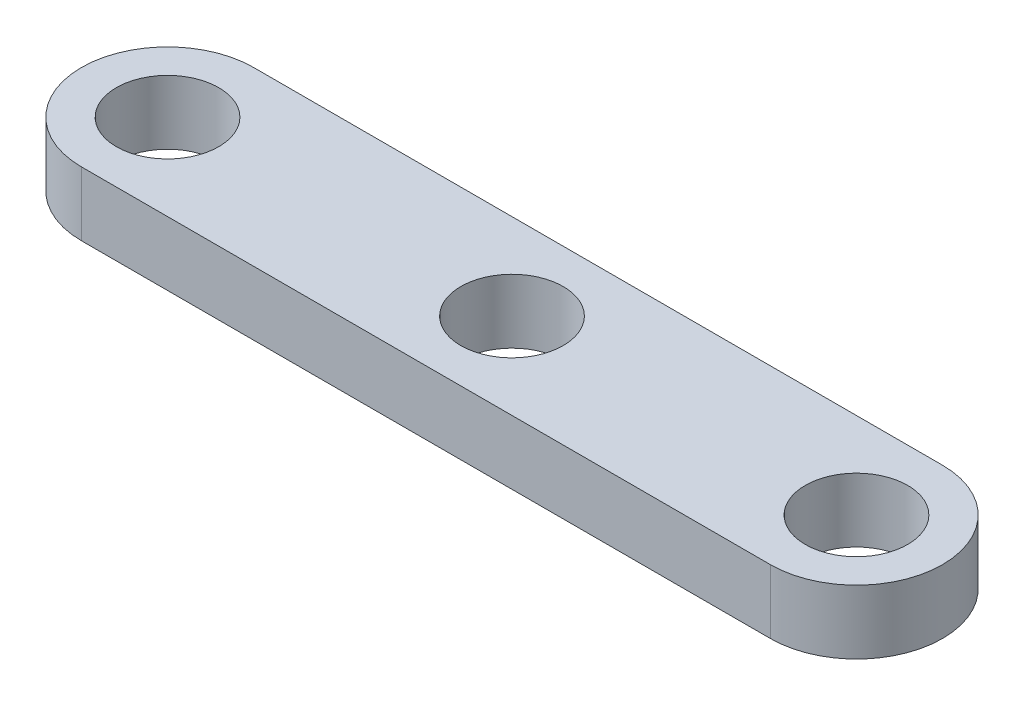
ISO-10303-21;
HEADER;
FILE_DESCRIPTION(('STEP AP214'),'2;1');
FILE_NAME('part.step','',(''),(''),'','','');
FILE_SCHEMA(('AUTOMOTIVE_DESIGN { 1 0 10303 214 1 1 1 1 }'));
ENDSEC;
DATA;
#1=APPLICATION_CONTEXT('core data for automotive mechanical design processes');
#2=APPLICATION_PROTOCOL_DEFINITION('international standard','automotive_design',2000,#1);
#3=PRODUCT_CONTEXT('',#1,'mechanical');
#4=PRODUCT('Part','Part','',(#3));
#5=PRODUCT_RELATED_PRODUCT_CATEGORY('part','',(#4));
#6=PRODUCT_DEFINITION_FORMATION('','',#4);
#7=PRODUCT_DEFINITION_CONTEXT('part definition',#1,'design');
#8=PRODUCT_DEFINITION('design','',#6,#7);
#9=PRODUCT_DEFINITION_SHAPE('','',#8);
#10=(LENGTH_UNIT() NAMED_UNIT(*) SI_UNIT(.MILLI.,.METRE.));
#11=(NAMED_UNIT(*) PLANE_ANGLE_UNIT() SI_UNIT($,.RADIAN.));
#12=(NAMED_UNIT(*) SI_UNIT($,.STERADIAN.) SOLID_ANGLE_UNIT());
#13=UNCERTAINTY_MEASURE_WITH_UNIT(LENGTH_MEASURE(1.E-05),#10,'distance_accuracy_value','');
#14=(GEOMETRIC_REPRESENTATION_CONTEXT(3) GLOBAL_UNCERTAINTY_ASSIGNED_CONTEXT((#13)) GLOBAL_UNIT_ASSIGNED_CONTEXT((#10,
#11,#12)) REPRESENTATION_CONTEXT('',''));
#15=CARTESIAN_POINT('',(0.,0.,0.));
#16=DIRECTION('',(0.,0.,1.));
#17=DIRECTION('',(1.,0.,0.));
#18=AXIS2_PLACEMENT_3D('',#15,#16,#17);
#19=CARTESIAN_POINT('',(0.,3.,4.035));
#20=DIRECTION('',(0.,0.,-1.));
#21=DIRECTION('',(-1.,0.,0.));
#22=AXIS2_PLACEMENT_3D('',#19,#20,#21);
#23=PLANE('',#22);
#24=DIRECTION('',(1.,0.,0.));
#25=VECTOR('',#24,1.);
#26=CARTESIAN_POINT('',(0.,0.,4.035));
#27=LINE('',#26,#25);
#28=CARTESIAN_POINT('',(-16.145,0.,4.035));
#29=VERTEX_POINT('',#28);
#30=CARTESIAN_POINT('',(16.145,0.,4.035));
#31=VERTEX_POINT('',#30);
#32=EDGE_CURVE('E112',#29,#31,#27,.T.);
#33=ORIENTED_EDGE('',*,*,#32,.T.);
#34=DIRECTION('',(0.,-1.,0.));
#35=VECTOR('',#34,1.);
#36=CARTESIAN_POINT('',(16.145,3.,4.035));
#37=LINE('',#36,#35);
#38=CARTESIAN_POINT('',(16.145,3.,4.035));
#39=VERTEX_POINT('',#38);
#40=EDGE_CURVE('E11',#39,#31,#37,.T.);
#41=ORIENTED_EDGE('',*,*,#40,.F.);
#42=DIRECTION('',(1.,0.,0.));
#43=VECTOR('',#42,1.);
#44=CARTESIAN_POINT('',(0.,3.,4.035));
#45=LINE('',#44,#43);
#46=CARTESIAN_POINT('',(-16.145,3.,4.035));
#47=VERTEX_POINT('',#46);
#48=EDGE_CURVE('E88',#47,#39,#45,.T.);
#49=ORIENTED_EDGE('',*,*,#48,.F.);
#50=DIRECTION('',(0.,-1.,0.));
#51=VECTOR('',#50,1.);
#52=CARTESIAN_POINT('',(-16.145,3.,4.035));
#53=LINE('',#52,#51);
#54=EDGE_CURVE('E99',#47,#29,#53,.T.);
#55=ORIENTED_EDGE('',*,*,#54,.T.);
#56=EDGE_LOOP('',(#33,#41,#49,#55));
#57=FACE_BOUND('',#56,.T.);
#58=ADVANCED_FACE('F40',(#57),#23,.F.);
#59=CARTESIAN_POINT('',(16.145,3.,0.));
#60=DIRECTION('',(0.,-1.,0.));
#61=DIRECTION('',(0.,0.,-1.));
#62=AXIS2_PLACEMENT_3D('',#59,#60,#61);
#63=CYLINDRICAL_SURFACE('',#62,4.035);
#64=CARTESIAN_POINT('',(16.145,0.,0.));
#65=DIRECTION('',(0.,1.,0.));
#66=DIRECTION('',(0.,0.,1.));
#67=AXIS2_PLACEMENT_3D('',#64,#65,#66);
#68=CIRCLE('',#67,4.035);
#69=CARTESIAN_POINT('',(16.145,0.,-4.035));
#70=VERTEX_POINT('',#69);
#71=EDGE_CURVE('E93',#31,#70,#68,.T.);
#72=ORIENTED_EDGE('',*,*,#71,.T.);
#73=DIRECTION('',(0.,-1.,0.));
#74=VECTOR('',#73,1.);
#75=CARTESIAN_POINT('',(16.145,3.,-4.035));
#76=LINE('',#75,#74);
#77=CARTESIAN_POINT('',(16.145,3.,-4.035));
#78=VERTEX_POINT('',#77);
#79=EDGE_CURVE('E49',#78,#70,#76,.T.);
#80=ORIENTED_EDGE('',*,*,#79,.F.);
#81=CARTESIAN_POINT('',(16.145,3.,0.));
#82=DIRECTION('',(0.,1.,0.));
#83=DIRECTION('',(0.,0.,1.));
#84=AXIS2_PLACEMENT_3D('',#81,#82,#83);
#85=CIRCLE('',#84,4.035);
#86=EDGE_CURVE('E83',#39,#78,#85,.T.);
#87=ORIENTED_EDGE('',*,*,#86,.F.);
#88=ORIENTED_EDGE('',*,*,#40,.T.);
#89=EDGE_LOOP('',(#72,#80,#87,#88));
#90=FACE_BOUND('',#89,.T.);
#91=ADVANCED_FACE('F92',(#90),#63,.T.);
#92=CARTESIAN_POINT('',(0.,3.,-4.035));
#93=DIRECTION('',(0.,0.,-1.));
#94=DIRECTION('',(-1.,0.,0.));
#95=AXIS2_PLACEMENT_3D('',#92,#93,#94);
#96=PLANE('',#95);
#97=DIRECTION('',(1.,0.,0.));
#98=VECTOR('',#97,1.);
#99=CARTESIAN_POINT('',(0.,0.,-4.035));
#100=LINE('',#99,#98);
#101=CARTESIAN_POINT('',(-16.145,0.,-4.035));
#102=VERTEX_POINT('',#101);
#103=EDGE_CURVE('E116',#102,#70,#100,.T.);
#104=ORIENTED_EDGE('',*,*,#103,.F.);
#105=DIRECTION('',(0.,-1.,0.));
#106=VECTOR('',#105,1.);
#107=CARTESIAN_POINT('',(-16.145,3.,-4.035));
#108=LINE('',#107,#106);
#109=CARTESIAN_POINT('',(-16.145,3.,-4.035));
#110=VERTEX_POINT('',#109);
#111=EDGE_CURVE('E73',#110,#102,#108,.T.);
#112=ORIENTED_EDGE('',*,*,#111,.F.);
#113=DIRECTION('',(1.,0.,0.));
#114=VECTOR('',#113,1.);
#115=CARTESIAN_POINT('',(0.,3.,-4.035));
#116=LINE('',#115,#114);
#117=EDGE_CURVE('E86',#110,#78,#116,.T.);
#118=ORIENTED_EDGE('',*,*,#117,.T.);
#119=ORIENTED_EDGE('',*,*,#79,.T.);
#120=EDGE_LOOP('',(#104,#112,#118,#119));
#121=FACE_BOUND('',#120,.T.);
#122=ADVANCED_FACE('F97',(#121),#96,.T.);
#123=CARTESIAN_POINT('',(-16.145,3.,0.));
#124=DIRECTION('',(0.,-1.,0.));
#125=DIRECTION('',(0.,0.,-1.));
#126=AXIS2_PLACEMENT_3D('',#123,#124,#125);
#127=CYLINDRICAL_SURFACE('',#126,2.4);
#128=CARTESIAN_POINT('',(-16.145,3.,0.));
#129=DIRECTION('',(0.,1.,0.));
#130=DIRECTION('',(0.,0.,1.));
#131=AXIS2_PLACEMENT_3D('',#128,#129,#130);
#132=CIRCLE('',#131,2.4);
#133=CARTESIAN_POINT('',(-16.145,3.,2.4));
#134=VERTEX_POINT('',#133);
#135=EDGE_CURVE('E163',#134,#134,#132,.T.);
#136=ORIENTED_EDGE('',*,*,#135,.T.);
#137=EDGE_LOOP('',(#136));
#138=FACE_BOUND('',#137,.T.);
#139=CARTESIAN_POINT('',(-16.145,0.,0.));
#140=DIRECTION('',(0.,1.,0.));
#141=DIRECTION('',(0.,0.,1.));
#142=AXIS2_PLACEMENT_3D('',#139,#140,#141);
#143=CIRCLE('',#142,2.4);
#144=CARTESIAN_POINT('',(-16.145,0.,2.4));
#145=VERTEX_POINT('',#144);
#146=EDGE_CURVE('E109',#145,#145,#143,.T.);
#147=ORIENTED_EDGE('',*,*,#146,.F.);
#148=EDGE_LOOP('',(#147));
#149=FACE_BOUND('',#148,.T.);
#150=ADVANCED_FACE('F144',(#138,#149),#127,.F.);
#151=CARTESIAN_POINT('',(16.145,3.,0.));
#152=DIRECTION('',(0.,-1.,0.));
#153=DIRECTION('',(0.,0.,-1.));
#154=AXIS2_PLACEMENT_3D('',#151,#152,#153);
#155=CYLINDRICAL_SURFACE('',#154,2.4);
#156=CARTESIAN_POINT('',(16.145,3.,0.));
#157=DIRECTION('',(0.,1.,0.));
#158=DIRECTION('',(0.,0.,1.));
#159=AXIS2_PLACEMENT_3D('',#156,#157,#158);
#160=CIRCLE('',#159,2.4);
#161=CARTESIAN_POINT('',(16.145,3.,2.4));
#162=VERTEX_POINT('',#161);
#163=EDGE_CURVE('E157',#162,#162,#160,.T.);
#164=ORIENTED_EDGE('',*,*,#163,.T.);
#165=EDGE_LOOP('',(#164));
#166=FACE_BOUND('',#165,.T.);
#167=CARTESIAN_POINT('',(16.145,0.,0.));
#168=DIRECTION('',(0.,1.,0.));
#169=DIRECTION('',(0.,0.,1.));
#170=AXIS2_PLACEMENT_3D('',#167,#168,#169);
#171=CIRCLE('',#170,2.4);
#172=CARTESIAN_POINT('',(16.145,0.,2.4));
#173=VERTEX_POINT('',#172);
#174=EDGE_CURVE('E106',#173,#173,#171,.T.);
#175=ORIENTED_EDGE('',*,*,#174,.F.);
#176=EDGE_LOOP('',(#175));
#177=FACE_BOUND('',#176,.T.);
#178=ADVANCED_FACE('F146',(#166,#177),#155,.F.);
#179=CARTESIAN_POINT('',(0.,3.,0.));
#180=DIRECTION('',(0.,-1.,0.));
#181=DIRECTION('',(0.,0.,-1.));
#182=AXIS2_PLACEMENT_3D('',#179,#180,#181);
#183=CYLINDRICAL_SURFACE('',#182,2.4);
#184=CARTESIAN_POINT('',(0.,3.,0.));
#185=DIRECTION('',(0.,1.,0.));
#186=DIRECTION('',(0.,0.,1.));
#187=AXIS2_PLACEMENT_3D('',#184,#185,#186);
#188=CIRCLE('',#187,2.4);
#189=CARTESIAN_POINT('',(0.,3.,2.4));
#190=VERTEX_POINT('',#189);
#191=EDGE_CURVE('E119',#190,#190,#188,.T.);
#192=ORIENTED_EDGE('',*,*,#191,.T.);
#193=EDGE_LOOP('',(#192));
#194=FACE_BOUND('',#193,.T.);
#195=CARTESIAN_POINT('',(0.,0.,0.));
#196=DIRECTION('',(0.,1.,0.));
#197=DIRECTION('',(0.,0.,1.));
#198=AXIS2_PLACEMENT_3D('',#195,#196,#197);
#199=CIRCLE('',#198,2.4);
#200=CARTESIAN_POINT('',(0.,0.,2.4));
#201=VERTEX_POINT('',#200);
#202=EDGE_CURVE('E103',#201,#201,#199,.T.);
#203=ORIENTED_EDGE('',*,*,#202,.F.);
#204=EDGE_LOOP('',(#203));
#205=FACE_BOUND('',#204,.T.);
#206=ADVANCED_FACE('F42',(#194,#205),#183,.F.);
#207=CARTESIAN_POINT('',(-16.145,3.,0.));
#208=DIRECTION('',(0.,-1.,0.));
#209=DIRECTION('',(0.,0.,-1.));
#210=AXIS2_PLACEMENT_3D('',#207,#208,#209);
#211=CYLINDRICAL_SURFACE('',#210,4.035);
#212=CARTESIAN_POINT('',(-16.145,0.,0.));
#213=DIRECTION('',(0.,1.,0.));
#214=DIRECTION('',(0.,0.,1.));
#215=AXIS2_PLACEMENT_3D('',#212,#213,#214);
#216=CIRCLE('',#215,4.035);
#217=EDGE_CURVE('E76',#102,#29,#216,.T.);
#218=ORIENTED_EDGE('',*,*,#217,.T.);
#219=ORIENTED_EDGE('',*,*,#54,.F.);
#220=CARTESIAN_POINT('',(-16.145,3.,0.));
#221=DIRECTION('',(0.,1.,0.));
#222=DIRECTION('',(0.,0.,1.));
#223=AXIS2_PLACEMENT_3D('',#220,#221,#222);
#224=CIRCLE('',#223,4.035);
#225=EDGE_CURVE('E57',#110,#47,#224,.T.);
#226=ORIENTED_EDGE('',*,*,#225,.F.);
#227=ORIENTED_EDGE('',*,*,#111,.T.);
#228=EDGE_LOOP('',(#218,#219,#226,#227));
#229=FACE_BOUND('',#228,.T.);
#230=ADVANCED_FACE('F131',(#229),#211,.T.);
#231=CARTESIAN_POINT('',(0.,3.,0.));
#232=DIRECTION('',(0.,1.,0.));
#233=DIRECTION('',(0.,0.,1.));
#234=AXIS2_PLACEMENT_3D('',#231,#232,#233);
#235=PLANE('',#234);
#236=ORIENTED_EDGE('',*,*,#191,.F.);
#237=EDGE_LOOP('',(#236));
#238=FACE_BOUND('',#237,.T.);
#239=ORIENTED_EDGE('',*,*,#163,.F.);
#240=EDGE_LOOP('',(#239));
#241=FACE_BOUND('',#240,.T.);
#242=ORIENTED_EDGE('',*,*,#135,.F.);
#243=EDGE_LOOP('',(#242));
#244=FACE_BOUND('',#243,.T.);
#245=ORIENTED_EDGE('',*,*,#48,.T.);
#246=ORIENTED_EDGE('',*,*,#86,.T.);
#247=ORIENTED_EDGE('',*,*,#117,.F.);
#248=ORIENTED_EDGE('',*,*,#225,.T.);
#249=EDGE_LOOP('',(#245,#246,#247,#248));
#250=FACE_BOUND('',#249,.T.);
#251=ADVANCED_FACE('F84',(#238,#241,#244,#250),#235,.T.);
#252=CARTESIAN_POINT('',(0.,0.,0.));
#253=DIRECTION('',(0.,1.,0.));
#254=DIRECTION('',(0.,0.,1.));
#255=AXIS2_PLACEMENT_3D('',#252,#253,#254);
#256=PLANE('',#255);
#257=ORIENTED_EDGE('',*,*,#202,.T.);
#258=EDGE_LOOP('',(#257));
#259=FACE_BOUND('',#258,.T.);
#260=ORIENTED_EDGE('',*,*,#174,.T.);
#261=EDGE_LOOP('',(#260));
#262=FACE_BOUND('',#261,.T.);
#263=ORIENTED_EDGE('',*,*,#146,.T.);
#264=EDGE_LOOP('',(#263));
#265=FACE_BOUND('',#264,.T.);
#266=ORIENTED_EDGE('',*,*,#32,.F.);
#267=ORIENTED_EDGE('',*,*,#217,.F.);
#268=ORIENTED_EDGE('',*,*,#103,.T.);
#269=ORIENTED_EDGE('',*,*,#71,.F.);
#270=EDGE_LOOP('',(#266,#267,#268,#269));
#271=FACE_BOUND('',#270,.T.);
#272=ADVANCED_FACE('F124',(#259,#262,#265,#271),#256,.F.);
#273=CLOSED_SHELL('',(#58,#91,#122,#150,#178,#206,#230,#251,#272));
#274=MANIFOLD_SOLID_BREP('B2',#273);
#275=ADVANCED_BREP_SHAPE_REPRESENTATION('',(#18,#274),#14);
#276=SHAPE_DEFINITION_REPRESENTATION(#9,#275);
ENDSEC;
END-ISO-10303-21;
